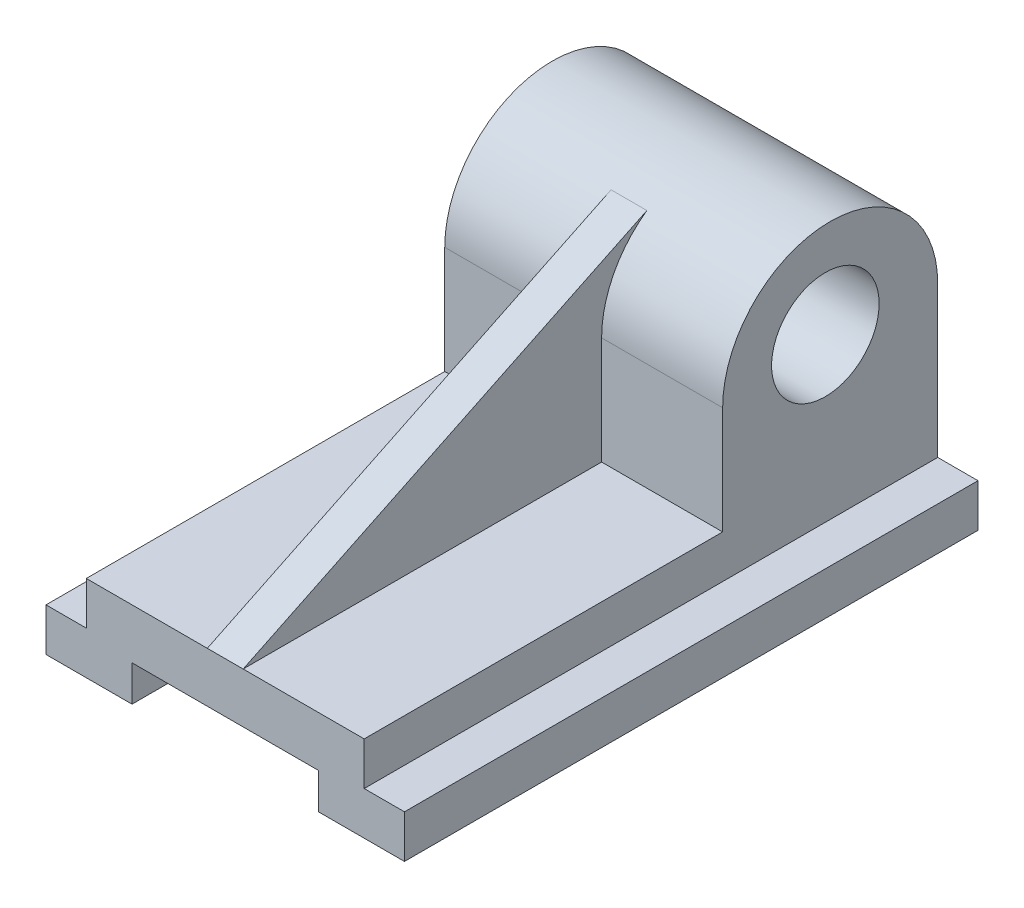
ISO-10303-21;
HEADER;
FILE_DESCRIPTION(('STEP AP214'),'2;1');
FILE_NAME('part.step','',(''),(''),'','','');
FILE_SCHEMA(('AUTOMOTIVE_DESIGN { 1 0 10303 214 1 1 1 1 }'));
ENDSEC;
DATA;
#1=APPLICATION_CONTEXT('core data for automotive mechanical design processes');
#2=APPLICATION_PROTOCOL_DEFINITION('international standard','automotive_design',2000,#1);
#3=PRODUCT_CONTEXT('',#1,'mechanical');
#4=PRODUCT('Part','Part','',(#3));
#5=PRODUCT_RELATED_PRODUCT_CATEGORY('part','',(#4));
#6=PRODUCT_DEFINITION_FORMATION('','',#4);
#7=PRODUCT_DEFINITION_CONTEXT('part definition',#1,'design');
#8=PRODUCT_DEFINITION('design','',#6,#7);
#9=PRODUCT_DEFINITION_SHAPE('','',#8);
#10=(LENGTH_UNIT() NAMED_UNIT(*) SI_UNIT(.MILLI.,.METRE.));
#11=(NAMED_UNIT(*) PLANE_ANGLE_UNIT() SI_UNIT($,.RADIAN.));
#12=(NAMED_UNIT(*) SI_UNIT($,.STERADIAN.) SOLID_ANGLE_UNIT());
#13=UNCERTAINTY_MEASURE_WITH_UNIT(LENGTH_MEASURE(1.E-05),#10,'distance_accuracy_value','');
#14=(GEOMETRIC_REPRESENTATION_CONTEXT(3) GLOBAL_UNCERTAINTY_ASSIGNED_CONTEXT((#13)) GLOBAL_UNIT_ASSIGNED_CONTEXT((#10,
#11,#12)) REPRESENTATION_CONTEXT('',''));
#15=CARTESIAN_POINT('',(0.,0.,0.));
#16=DIRECTION('',(0.,0.,1.));
#17=DIRECTION('',(1.,0.,0.));
#18=AXIS2_PLACEMENT_3D('',#15,#16,#17);
#19=CARTESIAN_POINT('',(-50.,12.,160.));
#20=DIRECTION('',(0.,-1.,0.));
#21=DIRECTION('',(0.,0.,-1.));
#22=AXIS2_PLACEMENT_3D('',#19,#20,#21);
#23=PLANE('',#22);
#24=DIRECTION('',(0.,0.,1.));
#25=VECTOR('',#24,1.);
#26=CARTESIAN_POINT('',(-5.,12.,160.));
#27=LINE('',#26,#25);
#28=CARTESIAN_POINT('',(-5.,12.,60.));
#29=VERTEX_POINT('',#28);
#30=CARTESIAN_POINT('',(-5.,12.,160.));
#31=VERTEX_POINT('',#30);
#32=EDGE_CURVE('E172',#29,#31,#27,.T.);
#33=ORIENTED_EDGE('',*,*,#32,.F.);
#34=DIRECTION('',(1.,0.,0.));
#35=VECTOR('',#34,1.);
#36=CARTESIAN_POINT('',(-38.7636642401503,12.,60.));
#37=LINE('',#36,#35);
#38=CARTESIAN_POINT('',(-38.7636642401503,12.,60.));
#39=VERTEX_POINT('',#38);
#40=EDGE_CURVE('E158',#39,#29,#37,.T.);
#41=ORIENTED_EDGE('',*,*,#40,.F.);
#42=DIRECTION('',(0.,0.,1.));
#43=VECTOR('',#42,1.);
#44=CARTESIAN_POINT('',(-38.7636642401503,12.,0.));
#45=LINE('',#44,#43);
#46=CARTESIAN_POINT('',(-38.7636642401503,12.,160.));
#47=VERTEX_POINT('',#46);
#48=EDGE_CURVE('E212',#39,#47,#45,.T.);
#49=ORIENTED_EDGE('',*,*,#48,.T.);
#50=DIRECTION('',(-1.,0.,0.));
#51=VECTOR('',#50,1.);
#52=CARTESIAN_POINT('',(-50.,12.,160.));
#53=LINE('',#52,#51);
#54=EDGE_CURVE('E173',#31,#47,#53,.T.);
#55=ORIENTED_EDGE('',*,*,#54,.F.);
#56=EDGE_LOOP('',(#33,#41,#49,#55));
#57=FACE_BOUND('',#56,.T.);
#58=ADVANCED_FACE('F34',(#57),#23,.F.);
#59=CARTESIAN_POINT('',(-38.7636642401503,72.,60.));
#60=DIRECTION('',(0.,0.,-1.));
#61=DIRECTION('',(-1.,0.,0.));
#62=AXIS2_PLACEMENT_3D('',#59,#60,#61);
#63=PLANE('',#62);
#64=DIRECTION('',(0.,-1.,0.));
#65=VECTOR('',#64,1.);
#66=CARTESIAN_POINT('',(-5.,72.,60.));
#67=LINE('',#66,#65);
#68=CARTESIAN_POINT('',(-5.,42.,60.));
#69=VERTEX_POINT('',#68);
#70=EDGE_CURVE('E162',#69,#29,#67,.T.);
#71=ORIENTED_EDGE('',*,*,#70,.F.);
#72=DIRECTION('',(-1.,0.,0.));
#73=VECTOR('',#72,1.);
#74=CARTESIAN_POINT('',(38.7636642401503,42.,60.));
#75=LINE('',#74,#73);
#76=CARTESIAN_POINT('',(-38.7636642401503,42.,60.));
#77=VERTEX_POINT('',#76);
#78=EDGE_CURVE('E287',#69,#77,#75,.T.);
#79=ORIENTED_EDGE('',*,*,#78,.T.);
#80=DIRECTION('',(0.,-1.,0.));
#81=VECTOR('',#80,1.);
#82=CARTESIAN_POINT('',(-38.7636642401503,72.,60.));
#83=LINE('',#82,#81);
#84=EDGE_CURVE('E164',#77,#39,#83,.T.);
#85=ORIENTED_EDGE('',*,*,#84,.T.);
#86=ORIENTED_EDGE('',*,*,#40,.T.);
#87=EDGE_LOOP('',(#71,#79,#85,#86));
#88=FACE_BOUND('',#87,.T.);
#89=ADVANCED_FACE('F160',(#88),#63,.F.);
#90=CARTESIAN_POINT('',(38.7636642401503,42.,30.));
#91=DIRECTION('',(1.,0.,0.));
#92=DIRECTION('',(0.,0.,-1.));
#93=AXIS2_PLACEMENT_3D('',#90,#91,#92);
#94=CYLINDRICAL_SURFACE('',#93,30.);
#95=CARTESIAN_POINT('',(38.7636642401503,42.,30.));
#96=DIRECTION('',(-1.,0.,0.));
#97=DIRECTION('',(0.,0.,1.));
#98=AXIS2_PLACEMENT_3D('',#95,#96,#97);
#99=CIRCLE('',#98,30.);
#100=CARTESIAN_POINT('',(38.7636642401503,42.,0.));
#101=VERTEX_POINT('',#100);
#102=CARTESIAN_POINT('',(38.7636642401503,42.,60.));
#103=VERTEX_POINT('',#102);
#104=EDGE_CURVE('E44',#101,#103,#99,.F.);
#105=ORIENTED_EDGE('',*,*,#104,.F.);
#106=DIRECTION('',(-1.,0.,0.));
#107=VECTOR('',#106,1.);
#108=CARTESIAN_POINT('',(38.7636642401503,42.,0.));
#109=LINE('',#108,#107);
#110=CARTESIAN_POINT('',(-38.7636642401503,42.,0.));
#111=VERTEX_POINT('',#110);
#112=EDGE_CURVE('E291',#111,#101,#109,.F.);
#113=ORIENTED_EDGE('',*,*,#112,.F.);
#114=CARTESIAN_POINT('',(-38.7636642401503,42.,30.));
#115=DIRECTION('',(-1.,0.,0.));
#116=DIRECTION('',(0.,0.,1.));
#117=AXIS2_PLACEMENT_3D('',#114,#115,#116);
#118=CIRCLE('',#117,30.);
#119=EDGE_CURVE('E11',#77,#111,#118,.T.);
#120=ORIENTED_EDGE('',*,*,#119,.F.);
#121=ORIENTED_EDGE('',*,*,#78,.F.);
#122=CARTESIAN_POINT('',(-5.,42.,30.));
#123=DIRECTION('',(1.,0.,0.));
#124=DIRECTION('',(0.,0.,-1.));
#125=AXIS2_PLACEMENT_3D('',#122,#123,#124);
#126=CIRCLE('',#125,30.);
#127=CARTESIAN_POINT('',(-5.,66.4600925145102,47.3696250443584));
#128=VERTEX_POINT('',#127);
#129=EDGE_CURVE('E56',#69,#128,#126,.F.);
#130=ORIENTED_EDGE('',*,*,#129,.T.);
#131=DIRECTION('',(1.,0.,0.));
#132=VECTOR('',#131,1.);
#133=CARTESIAN_POINT('',(38.7636642401503,66.4600925145102,47.3696250443584));
#134=LINE('',#133,#132);
#135=CARTESIAN_POINT('',(5.,66.4600925145102,47.3696250443584));
#136=VERTEX_POINT('',#135);
#137=EDGE_CURVE('E51',#136,#128,#134,.F.);
#138=ORIENTED_EDGE('',*,*,#137,.F.);
#139=CARTESIAN_POINT('',(5.,42.,30.));
#140=DIRECTION('',(1.,0.,0.));
#141=DIRECTION('',(0.,0.,-1.));
#142=AXIS2_PLACEMENT_3D('',#139,#140,#141);
#143=CIRCLE('',#142,30.);
#144=CARTESIAN_POINT('',(5.,42.,60.));
#145=VERTEX_POINT('',#144);
#146=EDGE_CURVE('E192',#145,#136,#143,.F.);
#147=ORIENTED_EDGE('',*,*,#146,.F.);
#148=EDGE_CURVE('E288',#103,#145,#75,.T.);
#149=ORIENTED_EDGE('',*,*,#148,.F.);
#150=EDGE_LOOP('',(#105,#113,#120,#121,#130,#138,#147,#149));
#151=FACE_BOUND('',#150,.T.);
#152=ADVANCED_FACE('F37',(#151),#94,.T.);
#153=CARTESIAN_POINT('',(5.,12.,60.));
#154=VERTEX_POINT('',#153);
#155=CARTESIAN_POINT('',(38.7636642401503,12.,60.));
#156=VERTEX_POINT('',#155);
#157=EDGE_CURVE('E169',#154,#156,#37,.T.);
#158=ORIENTED_EDGE('',*,*,#157,.F.);
#159=DIRECTION('',(0.,0.,1.));
#160=VECTOR('',#159,1.);
#161=CARTESIAN_POINT('',(5.,12.,160.));
#162=LINE('',#161,#160);
#163=CARTESIAN_POINT('',(5.,12.,160.));
#164=VERTEX_POINT('',#163);
#165=EDGE_CURVE('E190',#154,#164,#162,.T.);
#166=ORIENTED_EDGE('',*,*,#165,.T.);
#167=CARTESIAN_POINT('',(38.7636642401503,12.,160.));
#168=VERTEX_POINT('',#167);
#169=EDGE_CURVE('E264',#168,#164,#53,.T.);
#170=ORIENTED_EDGE('',*,*,#169,.F.);
#171=DIRECTION('',(0.,0.,1.));
#172=VECTOR('',#171,1.);
#173=CARTESIAN_POINT('',(38.7636642401503,12.,0.));
#174=LINE('',#173,#172);
#175=EDGE_CURVE('E224',#156,#168,#174,.T.);
#176=ORIENTED_EDGE('',*,*,#175,.F.);
#177=EDGE_LOOP('',(#158,#166,#170,#176));
#178=FACE_BOUND('',#177,.T.);
#179=ADVANCED_FACE('F333',(#178),#23,.F.);
#180=CARTESIAN_POINT('',(-50.,12.,160.));
#181=DIRECTION('',(1.,0.,0.));
#182=DIRECTION('',(0.,0.,-1.));
#183=AXIS2_PLACEMENT_3D('',#180,#181,#182);
#184=PLANE('',#183);
#185=DIRECTION('',(0.,0.,1.));
#186=VECTOR('',#185,1.);
#187=CARTESIAN_POINT('',(-50.,0.,160.));
#188=LINE('',#187,#186);
#189=CARTESIAN_POINT('',(-50.,0.,0.));
#190=VERTEX_POINT('',#189);
#191=CARTESIAN_POINT('',(-50.,0.,160.));
#192=VERTEX_POINT('',#191);
#193=EDGE_CURVE('E214',#190,#192,#188,.T.);
#194=ORIENTED_EDGE('',*,*,#193,.F.);
#195=DIRECTION('',(0.,-1.,0.));
#196=VECTOR('',#195,1.);
#197=CARTESIAN_POINT('',(-50.,12.,0.));
#198=LINE('',#197,#196);
#199=CARTESIAN_POINT('',(-50.,-12.,0.));
#200=VERTEX_POINT('',#199);
#201=EDGE_CURVE('E277',#190,#200,#198,.T.);
#202=ORIENTED_EDGE('',*,*,#201,.T.);
#203=DIRECTION('',(0.,0.,-1.));
#204=VECTOR('',#203,1.);
#205=CARTESIAN_POINT('',(-50.,-12.,160.));
#206=LINE('',#205,#204);
#207=CARTESIAN_POINT('',(-50.,-12.,160.));
#208=VERTEX_POINT('',#207);
#209=EDGE_CURVE('E284',#208,#200,#206,.T.);
#210=ORIENTED_EDGE('',*,*,#209,.F.);
#211=DIRECTION('',(0.,-1.,0.));
#212=VECTOR('',#211,1.);
#213=CARTESIAN_POINT('',(-50.,12.,160.));
#214=LINE('',#213,#212);
#215=EDGE_CURVE('E267',#192,#208,#214,.T.);
#216=ORIENTED_EDGE('',*,*,#215,.F.);
#217=EDGE_LOOP('',(#194,#202,#210,#216));
#218=FACE_BOUND('',#217,.T.);
#219=ADVANCED_FACE('F352',(#218),#184,.F.);
#220=CARTESIAN_POINT('',(0.,0.,160.));
#221=DIRECTION('',(0.,0.,1.));
#222=DIRECTION('',(1.,0.,0.));
#223=AXIS2_PLACEMENT_3D('',#220,#221,#222);
#224=PLANE('',#223);
#225=ORIENTED_EDGE('',*,*,#169,.T.);
#226=EDGE_CURVE('E268',#164,#31,#53,.T.);
#227=ORIENTED_EDGE('',*,*,#226,.T.);
#228=ORIENTED_EDGE('',*,*,#54,.T.);
#229=DIRECTION('',(0.,-1.,0.));
#230=VECTOR('',#229,1.);
#231=CARTESIAN_POINT('',(-38.7636642401503,12.,160.));
#232=LINE('',#231,#230);
#233=CARTESIAN_POINT('',(-38.7636642401503,0.,160.));
#234=VERTEX_POINT('',#233);
#235=EDGE_CURVE('E205',#47,#234,#232,.T.);
#236=ORIENTED_EDGE('',*,*,#235,.T.);
#237=DIRECTION('',(-1.,0.,0.));
#238=VECTOR('',#237,1.);
#239=CARTESIAN_POINT('',(-50.7636642401503,0.,160.));
#240=LINE('',#239,#238);
#241=EDGE_CURVE('E201',#234,#192,#240,.T.);
#242=ORIENTED_EDGE('',*,*,#241,.T.);
#243=ORIENTED_EDGE('',*,*,#215,.T.);
#244=DIRECTION('',(1.,0.,0.));
#245=VECTOR('',#244,1.);
#246=CARTESIAN_POINT('',(-50.,-12.,160.));
#247=LINE('',#246,#245);
#248=CARTESIAN_POINT('',(-26.,-12.,160.));
#249=VERTEX_POINT('',#248);
#250=EDGE_CURVE('E271',#208,#249,#247,.T.);
#251=ORIENTED_EDGE('',*,*,#250,.T.);
#252=DIRECTION('',(0.,-1.,0.));
#253=VECTOR('',#252,1.);
#254=CARTESIAN_POINT('',(-26.,-12.,160.));
#255=LINE('',#254,#253);
#256=CARTESIAN_POINT('',(-26.,-2.,160.));
#257=VERTEX_POINT('',#256);
#258=EDGE_CURVE('E234',#257,#249,#255,.T.);
#259=ORIENTED_EDGE('',*,*,#258,.F.);
#260=DIRECTION('',(-1.,0.,0.));
#261=VECTOR('',#260,1.);
#262=CARTESIAN_POINT('',(-26.,-2.,160.));
#263=LINE('',#262,#261);
#264=CARTESIAN_POINT('',(26.,-2.,160.));
#265=VERTEX_POINT('',#264);
#266=EDGE_CURVE('E239',#265,#257,#263,.T.);
#267=ORIENTED_EDGE('',*,*,#266,.F.);
#268=DIRECTION('',(0.,1.,0.));
#269=VECTOR('',#268,1.);
#270=CARTESIAN_POINT('',(26.,-12.,160.));
#271=LINE('',#270,#269);
#272=CARTESIAN_POINT('',(26.,-12.,160.));
#273=VERTEX_POINT('',#272);
#274=EDGE_CURVE('E246',#273,#265,#271,.T.);
#275=ORIENTED_EDGE('',*,*,#274,.F.);
#276=CARTESIAN_POINT('',(50.,-12.,160.));
#277=VERTEX_POINT('',#276);
#278=EDGE_CURVE('E270',#273,#277,#247,.T.);
#279=ORIENTED_EDGE('',*,*,#278,.T.);
#280=DIRECTION('',(0.,1.,0.));
#281=VECTOR('',#280,1.);
#282=CARTESIAN_POINT('',(50.,12.,160.));
#283=LINE('',#282,#281);
#284=CARTESIAN_POINT('',(50.,0.,160.));
#285=VERTEX_POINT('',#284);
#286=EDGE_CURVE('E260',#277,#285,#283,.T.);
#287=ORIENTED_EDGE('',*,*,#286,.T.);
#288=DIRECTION('',(1.,0.,0.));
#289=VECTOR('',#288,1.);
#290=CARTESIAN_POINT('',(50.7636642401503,0.,160.));
#291=LINE('',#290,#289);
#292=CARTESIAN_POINT('',(38.7636642401503,0.,160.));
#293=VERTEX_POINT('',#292);
#294=EDGE_CURVE('E221',#293,#285,#291,.T.);
#295=ORIENTED_EDGE('',*,*,#294,.F.);
#296=DIRECTION('',(0.,-1.,0.));
#297=VECTOR('',#296,1.);
#298=CARTESIAN_POINT('',(38.7636642401503,12.,160.));
#299=LINE('',#298,#297);
#300=EDGE_CURVE('E217',#168,#293,#299,.T.);
#301=ORIENTED_EDGE('',*,*,#300,.F.);
#302=EDGE_LOOP('',(#225,#227,#228,#236,#242,#243,#251,#259,#267,#275,#279,#287,#295,#301));
#303=FACE_BOUND('',#302,.T.);
#304=ADVANCED_FACE('F323',(#303),#224,.T.);
#305=CARTESIAN_POINT('',(0.,0.,0.));
#306=DIRECTION('',(0.,0.,1.));
#307=DIRECTION('',(1.,0.,0.));
#308=AXIS2_PLACEMENT_3D('',#305,#306,#307);
#309=PLANE('',#308);
#310=DIRECTION('',(-1.,0.,0.));
#311=VECTOR('',#310,1.);
#312=CARTESIAN_POINT('',(-26.,-2.,0.));
#313=LINE('',#312,#311);
#314=CARTESIAN_POINT('',(26.,-2.,0.));
#315=VERTEX_POINT('',#314);
#316=CARTESIAN_POINT('',(-26.,-2.,0.));
#317=VERTEX_POINT('',#316);
#318=EDGE_CURVE('E242',#315,#317,#313,.T.);
#319=ORIENTED_EDGE('',*,*,#318,.T.);
#320=DIRECTION('',(0.,-1.,0.));
#321=VECTOR('',#320,1.);
#322=CARTESIAN_POINT('',(-26.,-12.,0.));
#323=LINE('',#322,#321);
#324=CARTESIAN_POINT('',(-26.,-12.,0.));
#325=VERTEX_POINT('',#324);
#326=EDGE_CURVE('E235',#317,#325,#323,.T.);
#327=ORIENTED_EDGE('',*,*,#326,.T.);
#328=DIRECTION('',(1.,0.,0.));
#329=VECTOR('',#328,1.);
#330=CARTESIAN_POINT('',(-50.,-12.,0.));
#331=LINE('',#330,#329);
#332=EDGE_CURVE('E263',#200,#325,#331,.T.);
#333=ORIENTED_EDGE('',*,*,#332,.F.);
#334=ORIENTED_EDGE('',*,*,#201,.F.);
#335=DIRECTION('',(-1.,0.,0.));
#336=VECTOR('',#335,1.);
#337=CARTESIAN_POINT('',(-50.7636642401503,0.,0.));
#338=LINE('',#337,#336);
#339=CARTESIAN_POINT('',(-38.7636642401503,0.,0.));
#340=VERTEX_POINT('',#339);
#341=EDGE_CURVE('E202',#340,#190,#338,.T.);
#342=ORIENTED_EDGE('',*,*,#341,.F.);
#343=DIRECTION('',(0.,-1.,0.));
#344=VECTOR('',#343,1.);
#345=CARTESIAN_POINT('',(-38.7636642401503,12.,0.));
#346=LINE('',#345,#344);
#347=EDGE_CURVE('E204',#111,#340,#346,.T.);
#348=ORIENTED_EDGE('',*,*,#347,.F.);
#349=ORIENTED_EDGE('',*,*,#112,.T.);
#350=DIRECTION('',(0.,-1.,0.));
#351=VECTOR('',#350,1.);
#352=CARTESIAN_POINT('',(38.7636642401503,12.,0.));
#353=LINE('',#352,#351);
#354=CARTESIAN_POINT('',(38.7636642401503,0.,0.));
#355=VERTEX_POINT('',#354);
#356=EDGE_CURVE('E218',#101,#355,#353,.T.);
#357=ORIENTED_EDGE('',*,*,#356,.T.);
#358=DIRECTION('',(1.,0.,0.));
#359=VECTOR('',#358,1.);
#360=CARTESIAN_POINT('',(50.7636642401503,0.,0.));
#361=LINE('',#360,#359);
#362=CARTESIAN_POINT('',(50.,0.,0.));
#363=VERTEX_POINT('',#362);
#364=EDGE_CURVE('E220',#355,#363,#361,.T.);
#365=ORIENTED_EDGE('',*,*,#364,.T.);
#366=DIRECTION('',(0.,1.,0.));
#367=VECTOR('',#366,1.);
#368=CARTESIAN_POINT('',(50.,12.,0.));
#369=LINE('',#368,#367);
#370=CARTESIAN_POINT('',(50.,-12.,0.));
#371=VERTEX_POINT('',#370);
#372=EDGE_CURVE('E253',#371,#363,#369,.T.);
#373=ORIENTED_EDGE('',*,*,#372,.F.);
#374=CARTESIAN_POINT('',(26.,-12.,0.));
#375=VERTEX_POINT('',#374);
#376=EDGE_CURVE('E279',#375,#371,#331,.T.);
#377=ORIENTED_EDGE('',*,*,#376,.F.);
#378=DIRECTION('',(0.,1.,0.));
#379=VECTOR('',#378,1.);
#380=CARTESIAN_POINT('',(26.,-12.,0.));
#381=LINE('',#380,#379);
#382=EDGE_CURVE('E238',#375,#315,#381,.T.);
#383=ORIENTED_EDGE('',*,*,#382,.T.);
#384=EDGE_LOOP('',(#319,#327,#333,#334,#342,#348,#349,#357,#365,#373,#377,#383));
#385=FACE_BOUND('',#384,.T.);
#386=ADVANCED_FACE('F345',(#385),#309,.F.);
#387=CARTESIAN_POINT('',(-50.,-12.,160.));
#388=DIRECTION('',(0.,1.,0.));
#389=DIRECTION('',(0.,0.,1.));
#390=AXIS2_PLACEMENT_3D('',#387,#388,#389);
#391=PLANE('',#390);
#392=ORIENTED_EDGE('',*,*,#332,.T.);
#393=DIRECTION('',(0.,0.,1.));
#394=VECTOR('',#393,1.);
#395=CARTESIAN_POINT('',(-26.,-12.,0.));
#396=LINE('',#395,#394);
#397=EDGE_CURVE('E244',#325,#249,#396,.T.);
#398=ORIENTED_EDGE('',*,*,#397,.T.);
#399=ORIENTED_EDGE('',*,*,#250,.F.);
#400=ORIENTED_EDGE('',*,*,#209,.T.);
#401=EDGE_LOOP('',(#392,#398,#399,#400));
#402=FACE_BOUND('',#401,.T.);
#403=ADVANCED_FACE('F357',(#402),#391,.F.);
#404=CARTESIAN_POINT('',(50.,12.,160.));
#405=DIRECTION('',(-1.,0.,0.));
#406=DIRECTION('',(0.,0.,1.));
#407=AXIS2_PLACEMENT_3D('',#404,#405,#406);
#408=PLANE('',#407);
#409=ORIENTED_EDGE('',*,*,#372,.T.);
#410=DIRECTION('',(0.,0.,1.));
#411=VECTOR('',#410,1.);
#412=CARTESIAN_POINT('',(50.,0.,160.));
#413=LINE('',#412,#411);
#414=EDGE_CURVE('E230',#363,#285,#413,.T.);
#415=ORIENTED_EDGE('',*,*,#414,.T.);
#416=ORIENTED_EDGE('',*,*,#286,.F.);
#417=DIRECTION('',(0.,0.,-1.));
#418=VECTOR('',#417,1.);
#419=CARTESIAN_POINT('',(50.,-12.,160.));
#420=LINE('',#419,#418);
#421=EDGE_CURVE('E274',#277,#371,#420,.T.);
#422=ORIENTED_EDGE('',*,*,#421,.T.);
#423=EDGE_LOOP('',(#409,#415,#416,#422));
#424=FACE_BOUND('',#423,.T.);
#425=ADVANCED_FACE('F340',(#424),#408,.F.);
#426=ORIENTED_EDGE('',*,*,#278,.F.);
#427=DIRECTION('',(0.,0.,1.));
#428=VECTOR('',#427,1.);
#429=CARTESIAN_POINT('',(26.,-12.,0.));
#430=LINE('',#429,#428);
#431=EDGE_CURVE('E256',#375,#273,#430,.T.);
#432=ORIENTED_EDGE('',*,*,#431,.F.);
#433=ORIENTED_EDGE('',*,*,#376,.T.);
#434=ORIENTED_EDGE('',*,*,#421,.F.);
#435=EDGE_LOOP('',(#426,#432,#433,#434));
#436=FACE_BOUND('',#435,.T.);
#437=ADVANCED_FACE('F373',(#436),#391,.F.);
#438=CARTESIAN_POINT('',(-26.,-12.,0.));
#439=DIRECTION('',(-1.,0.,0.));
#440=DIRECTION('',(0.,0.,1.));
#441=AXIS2_PLACEMENT_3D('',#438,#439,#440);
#442=PLANE('',#441);
#443=ORIENTED_EDGE('',*,*,#258,.T.);
#444=ORIENTED_EDGE('',*,*,#397,.F.);
#445=ORIENTED_EDGE('',*,*,#326,.F.);
#446=DIRECTION('',(0.,0.,1.));
#447=VECTOR('',#446,1.);
#448=CARTESIAN_POINT('',(-26.,-2.,0.));
#449=LINE('',#448,#447);
#450=EDGE_CURVE('E250',#317,#257,#449,.T.);
#451=ORIENTED_EDGE('',*,*,#450,.T.);
#452=EDGE_LOOP('',(#443,#444,#445,#451));
#453=FACE_BOUND('',#452,.T.);
#454=ADVANCED_FACE('F363',(#453),#442,.F.);
#455=CARTESIAN_POINT('',(-26.,-2.,0.));
#456=DIRECTION('',(0.,1.,0.));
#457=DIRECTION('',(0.,0.,1.));
#458=AXIS2_PLACEMENT_3D('',#455,#456,#457);
#459=PLANE('',#458);
#460=ORIENTED_EDGE('',*,*,#266,.T.);
#461=ORIENTED_EDGE('',*,*,#450,.F.);
#462=ORIENTED_EDGE('',*,*,#318,.F.);
#463=DIRECTION('',(0.,0.,1.));
#464=VECTOR('',#463,1.);
#465=CARTESIAN_POINT('',(26.,-2.,0.));
#466=LINE('',#465,#464);
#467=EDGE_CURVE('E254',#315,#265,#466,.T.);
#468=ORIENTED_EDGE('',*,*,#467,.T.);
#469=EDGE_LOOP('',(#460,#461,#462,#468));
#470=FACE_BOUND('',#469,.T.);
#471=ADVANCED_FACE('F366',(#470),#459,.F.);
#472=CARTESIAN_POINT('',(26.,-12.,0.));
#473=DIRECTION('',(1.,0.,0.));
#474=DIRECTION('',(0.,0.,-1.));
#475=AXIS2_PLACEMENT_3D('',#472,#473,#474);
#476=PLANE('',#475);
#477=ORIENTED_EDGE('',*,*,#274,.T.);
#478=ORIENTED_EDGE('',*,*,#467,.F.);
#479=ORIENTED_EDGE('',*,*,#382,.F.);
#480=ORIENTED_EDGE('',*,*,#431,.T.);
#481=EDGE_LOOP('',(#477,#478,#479,#480));
#482=FACE_BOUND('',#481,.T.);
#483=ADVANCED_FACE('F369',(#482),#476,.F.);
#484=CARTESIAN_POINT('',(50.7636642401503,0.,0.));
#485=DIRECTION('',(0.,-1.,0.));
#486=DIRECTION('',(1.,0.,0.));
#487=AXIS2_PLACEMENT_3D('',#484,#485,#486);
#488=PLANE('',#487);
#489=ORIENTED_EDGE('',*,*,#364,.F.);
#490=DIRECTION('',(0.,0.,1.));
#491=VECTOR('',#490,1.);
#492=CARTESIAN_POINT('',(38.7636642401503,0.,0.));
#493=LINE('',#492,#491);
#494=EDGE_CURVE('E228',#355,#293,#493,.T.);
#495=ORIENTED_EDGE('',*,*,#494,.T.);
#496=ORIENTED_EDGE('',*,*,#294,.T.);
#497=ORIENTED_EDGE('',*,*,#414,.F.);
#498=EDGE_LOOP('',(#489,#495,#496,#497));
#499=FACE_BOUND('',#498,.T.);
#500=ADVANCED_FACE('F338',(#499),#488,.F.);
#501=CARTESIAN_POINT('',(38.7636642401503,12.,0.));
#502=DIRECTION('',(-1.,0.,0.));
#503=DIRECTION('',(0.,0.,1.));
#504=AXIS2_PLACEMENT_3D('',#501,#502,#503);
#505=PLANE('',#504);
#506=CARTESIAN_POINT('',(38.7636642401503,45.351147576028,31.3476421993073));
#507=DIRECTION('',(1.,0.,0.));
#508=DIRECTION('',(0.,0.,-1.));
#509=AXIS2_PLACEMENT_3D('',#506,#507,#508);
#510=CIRCLE('',#509,15.);
#511=CARTESIAN_POINT('',(38.7636642401503,45.351147576028,16.3476421993073));
#512=VERTEX_POINT('',#511);
#513=EDGE_CURVE('E195',#512,#512,#510,.T.);
#514=ORIENTED_EDGE('',*,*,#513,.F.);
#515=EDGE_LOOP('',(#514));
#516=FACE_BOUND('',#515,.T.);
#517=ORIENTED_EDGE('',*,*,#356,.F.);
#518=ORIENTED_EDGE('',*,*,#104,.T.);
#519=DIRECTION('',(0.,-1.,0.));
#520=VECTOR('',#519,1.);
#521=CARTESIAN_POINT('',(38.7636642401503,72.,60.));
#522=LINE('',#521,#520);
#523=EDGE_CURVE('E168',#103,#156,#522,.T.);
#524=ORIENTED_EDGE('',*,*,#523,.T.);
#525=ORIENTED_EDGE('',*,*,#175,.T.);
#526=ORIENTED_EDGE('',*,*,#300,.T.);
#527=ORIENTED_EDGE('',*,*,#494,.F.);
#528=EDGE_LOOP('',(#517,#518,#524,#525,#526,#527));
#529=FACE_BOUND('',#528,.T.);
#530=ADVANCED_FACE('F297',(#516,#529),#505,.F.);
#531=CARTESIAN_POINT('',(-50.7636642401503,0.,0.));
#532=DIRECTION('',(0.,1.,0.));
#533=DIRECTION('',(-1.,0.,0.));
#534=AXIS2_PLACEMENT_3D('',#531,#532,#533);
#535=PLANE('',#534);
#536=ORIENTED_EDGE('',*,*,#193,.T.);
#537=ORIENTED_EDGE('',*,*,#241,.F.);
#538=DIRECTION('',(0.,0.,1.));
#539=VECTOR('',#538,1.);
#540=CARTESIAN_POINT('',(-38.7636642401503,0.,0.));
#541=LINE('',#540,#539);
#542=EDGE_CURVE('E207',#340,#234,#541,.T.);
#543=ORIENTED_EDGE('',*,*,#542,.F.);
#544=ORIENTED_EDGE('',*,*,#341,.T.);
#545=EDGE_LOOP('',(#536,#537,#543,#544));
#546=FACE_BOUND('',#545,.T.);
#547=ADVANCED_FACE('F316',(#546),#535,.T.);
#548=CARTESIAN_POINT('',(-38.7636642401503,12.,0.));
#549=DIRECTION('',(-1.,0.,0.));
#550=DIRECTION('',(0.,0.,1.));
#551=AXIS2_PLACEMENT_3D('',#548,#549,#550);
#552=PLANE('',#551);
#553=CARTESIAN_POINT('',(-38.7636642401503,45.351147576028,31.3476421993073));
#554=DIRECTION('',(-1.,0.,0.));
#555=DIRECTION('',(0.,0.,1.));
#556=AXIS2_PLACEMENT_3D('',#553,#554,#555);
#557=CIRCLE('',#556,15.);
#558=CARTESIAN_POINT('',(-38.7636642401503,45.351147576028,46.3476421993073));
#559=VERTEX_POINT('',#558);
#560=EDGE_CURVE('E39',#559,#559,#557,.T.);
#561=ORIENTED_EDGE('',*,*,#560,.F.);
#562=EDGE_LOOP('',(#561));
#563=FACE_BOUND('',#562,.T.);
#564=ORIENTED_EDGE('',*,*,#84,.F.);
#565=ORIENTED_EDGE('',*,*,#119,.T.);
#566=ORIENTED_EDGE('',*,*,#347,.T.);
#567=ORIENTED_EDGE('',*,*,#542,.T.);
#568=ORIENTED_EDGE('',*,*,#235,.F.);
#569=ORIENTED_EDGE('',*,*,#48,.F.);
#570=EDGE_LOOP('',(#564,#565,#566,#567,#568,#569));
#571=FACE_BOUND('',#570,.T.);
#572=ADVANCED_FACE('F313',(#563,#571),#552,.T.);
#573=ORIENTED_EDGE('',*,*,#148,.T.);
#574=DIRECTION('',(0.,-1.,0.));
#575=VECTOR('',#574,1.);
#576=CARTESIAN_POINT('',(5.,72.,60.));
#577=LINE('',#576,#575);
#578=EDGE_CURVE('E188',#145,#154,#577,.T.);
#579=ORIENTED_EDGE('',*,*,#578,.T.);
#580=ORIENTED_EDGE('',*,*,#157,.T.);
#581=ORIENTED_EDGE('',*,*,#523,.F.);
#582=EDGE_LOOP('',(#573,#579,#580,#581));
#583=FACE_BOUND('',#582,.T.);
#584=ADVANCED_FACE('F304',(#583),#63,.F.);
#585=CARTESIAN_POINT('',(-50.,45.351147576028,31.3476421993073));
#586=DIRECTION('',(1.,0.,0.));
#587=DIRECTION('',(0.,0.,-1.));
#588=AXIS2_PLACEMENT_3D('',#585,#586,#587);
#589=CYLINDRICAL_SURFACE('',#588,15.);
#590=ORIENTED_EDGE('',*,*,#513,.T.);
#591=EDGE_LOOP('',(#590));
#592=FACE_BOUND('',#591,.T.);
#593=ORIENTED_EDGE('',*,*,#560,.T.);
#594=EDGE_LOOP('',(#593));
#595=FACE_BOUND('',#594,.T.);
#596=ADVANCED_FACE('F311',(#592,#595),#589,.F.);
#597=CARTESIAN_POINT('',(0.,12.,160.));
#598=DIRECTION('',(0.,-0.900279798313391,-0.435311709868688));
#599=DIRECTION('',(0.,0.435311709868688,-0.900279798313391));
#600=AXIS2_PLACEMENT_3D('',#597,#598,#599);
#601=PLANE('',#600);
#602=DIRECTION('',(0.,0.435311709868688,-0.900279798313391));
#603=VECTOR('',#602,1.);
#604=CARTESIAN_POINT('',(5.,12.,160.));
#605=LINE('',#604,#603);
#606=EDGE_CURVE('E180',#164,#136,#605,.T.);
#607=ORIENTED_EDGE('',*,*,#606,.T.);
#608=ORIENTED_EDGE('',*,*,#137,.T.);
#609=DIRECTION('',(0.,0.435311709868688,-0.900279798313391));
#610=VECTOR('',#609,1.);
#611=CARTESIAN_POINT('',(-5.,12.,160.));
#612=LINE('',#611,#610);
#613=EDGE_CURVE('E183',#31,#128,#612,.T.);
#614=ORIENTED_EDGE('',*,*,#613,.F.);
#615=ORIENTED_EDGE('',*,*,#226,.F.);
#616=EDGE_LOOP('',(#607,#608,#614,#615));
#617=FACE_BOUND('',#616,.T.);
#618=ADVANCED_FACE('F330',(#617),#601,.F.);
#619=CARTESIAN_POINT('',(5.,30.,80.));
#620=DIRECTION('',(1.,0.,0.));
#621=DIRECTION('',(0.,0.,-1.));
#622=AXIS2_PLACEMENT_3D('',#619,#620,#621);
#623=PLANE('',#622);
#624=ORIENTED_EDGE('',*,*,#578,.F.);
#625=ORIENTED_EDGE('',*,*,#146,.T.);
#626=ORIENTED_EDGE('',*,*,#606,.F.);
#627=ORIENTED_EDGE('',*,*,#165,.F.);
#628=EDGE_LOOP('',(#624,#625,#626,#627));
#629=FACE_BOUND('',#628,.T.);
#630=ADVANCED_FACE('F332',(#629),#623,.T.);
#631=CARTESIAN_POINT('',(-5.,30.,80.));
#632=DIRECTION('',(1.,0.,0.));
#633=DIRECTION('',(0.,0.,-1.));
#634=AXIS2_PLACEMENT_3D('',#631,#632,#633);
#635=PLANE('',#634);
#636=ORIENTED_EDGE('',*,*,#129,.F.);
#637=ORIENTED_EDGE('',*,*,#70,.T.);
#638=ORIENTED_EDGE('',*,*,#32,.T.);
#639=ORIENTED_EDGE('',*,*,#613,.T.);
#640=EDGE_LOOP('',(#636,#637,#638,#639));
#641=FACE_BOUND('',#640,.T.);
#642=ADVANCED_FACE('F179',(#641),#635,.F.);
#643=CLOSED_SHELL('',(#58,#89,#152,#179,#219,#304,#386,#403,#425,#437,#454,#471,#483,#500,#530,
#547,#572,#584,#596,#618,#630,#642));
#644=MANIFOLD_SOLID_BREP('B2',#643);
#645=ADVANCED_BREP_SHAPE_REPRESENTATION('',(#18,#644),#14);
#646=SHAPE_DEFINITION_REPRESENTATION(#9,#645);
ENDSEC;
END-ISO-10303-21;
